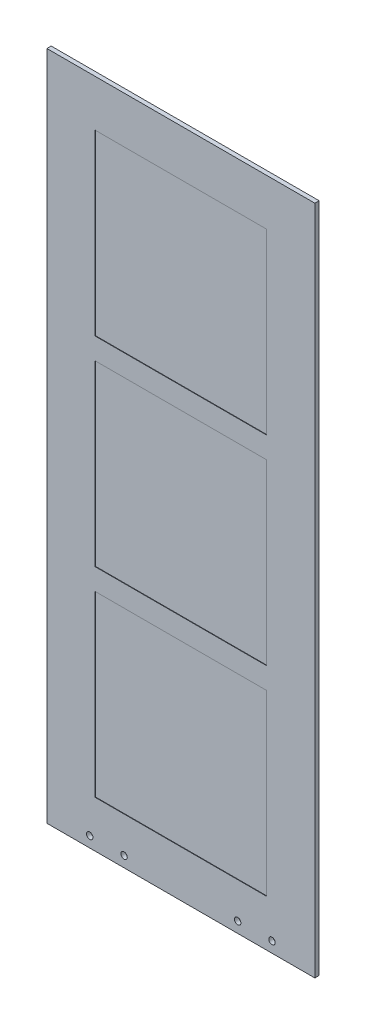
ISO-10303-21;
HEADER;
FILE_DESCRIPTION(('STEP AP214'),'2;1');
FILE_NAME('part.step','',(''),(''),'','','');
FILE_SCHEMA(('AUTOMOTIVE_DESIGN { 1 0 10303 214 1 1 1 1 }'));
ENDSEC;
DATA;
#1=APPLICATION_CONTEXT('core data for automotive mechanical design processes');
#2=APPLICATION_PROTOCOL_DEFINITION('international standard','automotive_design',2000,#1);
#3=PRODUCT_CONTEXT('',#1,'mechanical');
#4=PRODUCT('Part','Part','',(#3));
#5=PRODUCT_RELATED_PRODUCT_CATEGORY('part','',(#4));
#6=PRODUCT_DEFINITION_FORMATION('','',#4);
#7=PRODUCT_DEFINITION_CONTEXT('part definition',#1,'design');
#8=PRODUCT_DEFINITION('design','',#6,#7);
#9=PRODUCT_DEFINITION_SHAPE('','',#8);
#10=(LENGTH_UNIT() NAMED_UNIT(*) SI_UNIT(.MILLI.,.METRE.));
#11=(NAMED_UNIT(*) PLANE_ANGLE_UNIT() SI_UNIT($,.RADIAN.));
#12=(NAMED_UNIT(*) SI_UNIT($,.STERADIAN.) SOLID_ANGLE_UNIT());
#13=UNCERTAINTY_MEASURE_WITH_UNIT(LENGTH_MEASURE(1.E-05),#10,'distance_accuracy_value','');
#14=(GEOMETRIC_REPRESENTATION_CONTEXT(3) GLOBAL_UNCERTAINTY_ASSIGNED_CONTEXT((#13)) GLOBAL_UNIT_ASSIGNED_CONTEXT((#10,
#11,#12)) REPRESENTATION_CONTEXT('',''));
#15=CARTESIAN_POINT('',(0.,0.,0.));
#16=DIRECTION('',(0.,0.,1.));
#17=DIRECTION('',(1.,0.,0.));
#18=AXIS2_PLACEMENT_3D('',#15,#16,#17);
#19=CARTESIAN_POINT('',(0.,0.,1.771));
#20=DIRECTION('',(0.,0.,1.));
#21=DIRECTION('',(1.,0.,0.));
#22=AXIS2_PLACEMENT_3D('',#19,#20,#21);
#23=PLANE('',#22);
#24=DIRECTION('',(0.,1.,0.));
#25=VECTOR('',#24,1.);
#26=CARTESIAN_POINT('',(40.,51.586,1.771));
#27=LINE('',#26,#25);
#28=CARTESIAN_POINT('',(40.,134.758,1.771));
#29=VERTEX_POINT('',#28);
#30=CARTESIAN_POINT('',(40.,51.586,1.771));
#31=VERTEX_POINT('',#30);
#32=EDGE_CURVE('E134',#29,#31,#27,.F.);
#33=ORIENTED_EDGE('',*,*,#32,.F.);
#34=DIRECTION('',(1.,0.,0.));
#35=VECTOR('',#34,1.);
#36=CARTESIAN_POINT('',(-40.,134.758,1.771));
#37=LINE('',#36,#35);
#38=CARTESIAN_POINT('',(-40.,134.758,1.771));
#39=VERTEX_POINT('',#38);
#40=EDGE_CURVE('E275',#29,#39,#37,.F.);
#41=ORIENTED_EDGE('',*,*,#40,.T.);
#42=DIRECTION('',(0.,1.,0.));
#43=VECTOR('',#42,1.);
#44=CARTESIAN_POINT('',(-40.,134.758,1.771));
#45=LINE('',#44,#43);
#46=CARTESIAN_POINT('',(-40.,51.586,1.771));
#47=VERTEX_POINT('',#46);
#48=EDGE_CURVE('E148',#47,#39,#45,.T.);
#49=ORIENTED_EDGE('',*,*,#48,.F.);
#50=DIRECTION('',(1.,0.,0.));
#51=VECTOR('',#50,1.);
#52=CARTESIAN_POINT('',(40.,51.586,1.771));
#53=LINE('',#52,#51);
#54=EDGE_CURVE('E127',#47,#31,#53,.T.);
#55=ORIENTED_EDGE('',*,*,#54,.T.);
#56=EDGE_LOOP('',(#33,#41,#49,#55));
#57=FACE_BOUND('',#56,.T.);
#58=ADVANCED_FACE('F16',(#57),#23,.T.);
#59=CARTESIAN_POINT('',(0.,0.,1.771));
#60=DIRECTION('',(0.,0.,1.));
#61=DIRECTION('',(1.,0.,0.));
#62=AXIS2_PLACEMENT_3D('',#59,#60,#61);
#63=PLANE('',#62);
#64=DIRECTION('',(0.,1.,0.));
#65=VECTOR('',#64,1.);
#66=CARTESIAN_POINT('',(40.,51.586,1.771));
#67=LINE('',#66,#65);
#68=CARTESIAN_POINT('',(40.,41.586,1.771));
#69=VERTEX_POINT('',#68);
#70=CARTESIAN_POINT('',(40.,-41.586,1.771));
#71=VERTEX_POINT('',#70);
#72=EDGE_CURVE('E269',#69,#71,#67,.F.);
#73=ORIENTED_EDGE('',*,*,#72,.F.);
#74=DIRECTION('',(1.,0.,0.));
#75=VECTOR('',#74,1.);
#76=CARTESIAN_POINT('',(-40.,41.586,1.771));
#77=LINE('',#76,#75);
#78=CARTESIAN_POINT('',(-40.,41.586,1.771));
#79=VERTEX_POINT('',#78);
#80=EDGE_CURVE('E255',#69,#79,#77,.F.);
#81=ORIENTED_EDGE('',*,*,#80,.T.);
#82=DIRECTION('',(0.,1.,0.));
#83=VECTOR('',#82,1.);
#84=CARTESIAN_POINT('',(-40.,134.758,1.771));
#85=LINE('',#84,#83);
#86=CARTESIAN_POINT('',(-40.,-41.586,1.771));
#87=VERTEX_POINT('',#86);
#88=EDGE_CURVE('E258',#87,#79,#85,.T.);
#89=ORIENTED_EDGE('',*,*,#88,.F.);
#90=DIRECTION('',(1.,0.,0.));
#91=VECTOR('',#90,1.);
#92=CARTESIAN_POINT('',(40.,-41.586,1.771));
#93=LINE('',#92,#91);
#94=EDGE_CURVE('E266',#87,#71,#93,.T.);
#95=ORIENTED_EDGE('',*,*,#94,.T.);
#96=EDGE_LOOP('',(#73,#81,#89,#95));
#97=FACE_BOUND('',#96,.T.);
#98=ADVANCED_FACE('F378',(#97),#63,.T.);
#99=CARTESIAN_POINT('',(0.,0.,1.771));
#100=DIRECTION('',(0.,0.,1.));
#101=DIRECTION('',(1.,0.,0.));
#102=AXIS2_PLACEMENT_3D('',#99,#100,#101);
#103=PLANE('',#102);
#104=DIRECTION('',(0.,1.,0.));
#105=VECTOR('',#104,1.);
#106=CARTESIAN_POINT('',(40.,51.586,1.771));
#107=LINE('',#106,#105);
#108=CARTESIAN_POINT('',(40.,-51.586,1.771));
#109=VERTEX_POINT('',#108);
#110=CARTESIAN_POINT('',(40.,-134.758,1.771));
#111=VERTEX_POINT('',#110);
#112=EDGE_CURVE('E247',#109,#111,#107,.F.);
#113=ORIENTED_EDGE('',*,*,#112,.F.);
#114=DIRECTION('',(1.,0.,0.));
#115=VECTOR('',#114,1.);
#116=CARTESIAN_POINT('',(-40.,-51.586,1.771));
#117=LINE('',#116,#115);
#118=CARTESIAN_POINT('',(-40.,-51.586,1.771));
#119=VERTEX_POINT('',#118);
#120=EDGE_CURVE('E233',#109,#119,#117,.F.);
#121=ORIENTED_EDGE('',*,*,#120,.T.);
#122=DIRECTION('',(0.,1.,0.));
#123=VECTOR('',#122,1.);
#124=CARTESIAN_POINT('',(-40.,134.758,1.771));
#125=LINE('',#124,#123);
#126=CARTESIAN_POINT('',(-40.,-134.758,1.771));
#127=VERTEX_POINT('',#126);
#128=EDGE_CURVE('E236',#127,#119,#125,.T.);
#129=ORIENTED_EDGE('',*,*,#128,.F.);
#130=DIRECTION('',(1.,0.,0.));
#131=VECTOR('',#130,1.);
#132=CARTESIAN_POINT('',(40.,-134.758,1.771));
#133=LINE('',#132,#131);
#134=EDGE_CURVE('E244',#127,#111,#133,.T.);
#135=ORIENTED_EDGE('',*,*,#134,.T.);
#136=EDGE_LOOP('',(#113,#121,#129,#135));
#137=FACE_BOUND('',#136,.T.);
#138=ADVANCED_FACE('F382',(#137),#103,.T.);
#139=CARTESIAN_POINT('',(40.,51.586,1.996));
#140=DIRECTION('',(-1.,0.,0.));
#141=DIRECTION('',(0.,0.,1.));
#142=AXIS2_PLACEMENT_3D('',#139,#140,#141);
#143=PLANE('',#142);
#144=DIRECTION('',(0.,0.,1.));
#145=VECTOR('',#144,1.);
#146=CARTESIAN_POINT('',(40.,134.758,1.996));
#147=LINE('',#146,#145);
#148=CARTESIAN_POINT('',(40.,134.758,1.996));
#149=VERTEX_POINT('',#148);
#150=EDGE_CURVE('E139',#149,#29,#147,.F.);
#151=ORIENTED_EDGE('',*,*,#150,.T.);
#152=ORIENTED_EDGE('',*,*,#32,.T.);
#153=DIRECTION('',(0.,0.,-1.));
#154=VECTOR('',#153,1.);
#155=CARTESIAN_POINT('',(40.,51.586,1.996));
#156=LINE('',#155,#154);
#157=CARTESIAN_POINT('',(40.,51.586,1.996));
#158=VERTEX_POINT('',#157);
#159=EDGE_CURVE('E137',#31,#158,#156,.F.);
#160=ORIENTED_EDGE('',*,*,#159,.T.);
#161=DIRECTION('',(0.,1.,0.));
#162=VECTOR('',#161,1.);
#163=CARTESIAN_POINT('',(40.,0.,1.996));
#164=LINE('',#163,#162);
#165=EDGE_CURVE('E225',#149,#158,#164,.F.);
#166=ORIENTED_EDGE('',*,*,#165,.F.);
#167=EDGE_LOOP('',(#151,#152,#160,#166));
#168=FACE_BOUND('',#167,.T.);
#169=ADVANCED_FACE('F135',(#168),#143,.T.);
#170=CARTESIAN_POINT('',(40.,51.586,1.996));
#171=DIRECTION('',(0.,-1.,0.));
#172=DIRECTION('',(0.,0.,-1.));
#173=AXIS2_PLACEMENT_3D('',#170,#171,#172);
#174=PLANE('',#173);
#175=DIRECTION('',(1.,0.,0.));
#176=VECTOR('',#175,1.);
#177=CARTESIAN_POINT('',(0.,51.586,1.996));
#178=LINE('',#177,#176);
#179=CARTESIAN_POINT('',(-40.,51.586,1.996));
#180=VERTEX_POINT('',#179);
#181=EDGE_CURVE('E144',#158,#180,#178,.F.);
#182=ORIENTED_EDGE('',*,*,#181,.F.);
#183=ORIENTED_EDGE('',*,*,#159,.F.);
#184=ORIENTED_EDGE('',*,*,#54,.F.);
#185=DIRECTION('',(0.,0.,-1.));
#186=VECTOR('',#185,1.);
#187=CARTESIAN_POINT('',(-40.,51.586,1.996));
#188=LINE('',#187,#186);
#189=EDGE_CURVE('E145',#180,#47,#188,.T.);
#190=ORIENTED_EDGE('',*,*,#189,.F.);
#191=EDGE_LOOP('',(#182,#183,#184,#190));
#192=FACE_BOUND('',#191,.T.);
#193=ADVANCED_FACE('F143',(#192),#174,.F.);
#194=CARTESIAN_POINT('',(-40.,134.758,1.996));
#195=DIRECTION('',(1.,0.,0.));
#196=DIRECTION('',(0.,0.,-1.));
#197=AXIS2_PLACEMENT_3D('',#194,#195,#196);
#198=PLANE('',#197);
#199=ORIENTED_EDGE('',*,*,#189,.T.);
#200=ORIENTED_EDGE('',*,*,#48,.T.);
#201=DIRECTION('',(0.,0.,1.));
#202=VECTOR('',#201,1.);
#203=CARTESIAN_POINT('',(-40.,134.758,1.996));
#204=LINE('',#203,#202);
#205=CARTESIAN_POINT('',(-40.,134.758,1.996));
#206=VERTEX_POINT('',#205);
#207=EDGE_CURVE('E272',#39,#206,#204,.T.);
#208=ORIENTED_EDGE('',*,*,#207,.T.);
#209=DIRECTION('',(0.,1.,0.));
#210=VECTOR('',#209,1.);
#211=CARTESIAN_POINT('',(-40.,0.,1.996));
#212=LINE('',#211,#210);
#213=EDGE_CURVE('E222',#180,#206,#212,.T.);
#214=ORIENTED_EDGE('',*,*,#213,.F.);
#215=EDGE_LOOP('',(#199,#200,#208,#214));
#216=FACE_BOUND('',#215,.T.);
#217=ADVANCED_FACE('F279',(#216),#198,.T.);
#218=CARTESIAN_POINT('',(-40.,134.758,1.996));
#219=DIRECTION('',(0.,1.,0.));
#220=DIRECTION('',(0.,0.,1.));
#221=AXIS2_PLACEMENT_3D('',#218,#219,#220);
#222=PLANE('',#221);
#223=DIRECTION('',(1.,0.,0.));
#224=VECTOR('',#223,1.);
#225=CARTESIAN_POINT('',(0.,134.758,1.996));
#226=LINE('',#225,#224);
#227=EDGE_CURVE('E219',#206,#149,#226,.T.);
#228=ORIENTED_EDGE('',*,*,#227,.F.);
#229=ORIENTED_EDGE('',*,*,#207,.F.);
#230=ORIENTED_EDGE('',*,*,#40,.F.);
#231=ORIENTED_EDGE('',*,*,#150,.F.);
#232=EDGE_LOOP('',(#228,#229,#230,#231));
#233=FACE_BOUND('',#232,.T.);
#234=ADVANCED_FACE('F285',(#233),#222,.F.);
#235=CARTESIAN_POINT('',(40.,51.586,1.996));
#236=DIRECTION('',(-1.,0.,0.));
#237=DIRECTION('',(0.,0.,1.));
#238=AXIS2_PLACEMENT_3D('',#235,#236,#237);
#239=PLANE('',#238);
#240=DIRECTION('',(0.,0.,1.));
#241=VECTOR('',#240,1.);
#242=CARTESIAN_POINT('',(40.,41.586,1.996));
#243=LINE('',#242,#241);
#244=CARTESIAN_POINT('',(40.,41.586,1.996));
#245=VERTEX_POINT('',#244);
#246=EDGE_CURVE('E249',#245,#69,#243,.F.);
#247=ORIENTED_EDGE('',*,*,#246,.T.);
#248=ORIENTED_EDGE('',*,*,#72,.T.);
#249=DIRECTION('',(0.,0.,-1.));
#250=VECTOR('',#249,1.);
#251=CARTESIAN_POINT('',(40.,-41.586,1.996));
#252=LINE('',#251,#250);
#253=CARTESIAN_POINT('',(40.,-41.586,1.996));
#254=VERTEX_POINT('',#253);
#255=EDGE_CURVE('E263',#71,#254,#252,.F.);
#256=ORIENTED_EDGE('',*,*,#255,.T.);
#257=DIRECTION('',(0.,1.,0.));
#258=VECTOR('',#257,1.);
#259=CARTESIAN_POINT('',(40.,0.,1.996));
#260=LINE('',#259,#258);
#261=EDGE_CURVE('E217',#245,#254,#260,.F.);
#262=ORIENTED_EDGE('',*,*,#261,.F.);
#263=EDGE_LOOP('',(#247,#248,#256,#262));
#264=FACE_BOUND('',#263,.T.);
#265=ADVANCED_FACE('F287',(#264),#239,.T.);
#266=CARTESIAN_POINT('',(40.,-41.586,1.996));
#267=DIRECTION('',(0.,-1.,0.));
#268=DIRECTION('',(0.,0.,-1.));
#269=AXIS2_PLACEMENT_3D('',#266,#267,#268);
#270=PLANE('',#269);
#271=DIRECTION('',(1.,0.,0.));
#272=VECTOR('',#271,1.);
#273=CARTESIAN_POINT('',(0.,-41.586,1.996));
#274=LINE('',#273,#272);
#275=CARTESIAN_POINT('',(-40.,-41.586,1.996));
#276=VERTEX_POINT('',#275);
#277=EDGE_CURVE('E215',#254,#276,#274,.F.);
#278=ORIENTED_EDGE('',*,*,#277,.F.);
#279=ORIENTED_EDGE('',*,*,#255,.F.);
#280=ORIENTED_EDGE('',*,*,#94,.F.);
#281=DIRECTION('',(0.,0.,-1.));
#282=VECTOR('',#281,1.);
#283=CARTESIAN_POINT('',(-40.,-41.586,1.996));
#284=LINE('',#283,#282);
#285=EDGE_CURVE('E260',#276,#87,#284,.T.);
#286=ORIENTED_EDGE('',*,*,#285,.F.);
#287=EDGE_LOOP('',(#278,#279,#280,#286));
#288=FACE_BOUND('',#287,.T.);
#289=ADVANCED_FACE('F294',(#288),#270,.F.);
#290=CARTESIAN_POINT('',(-40.,134.758,1.996));
#291=DIRECTION('',(1.,0.,0.));
#292=DIRECTION('',(0.,0.,-1.));
#293=AXIS2_PLACEMENT_3D('',#290,#291,#292);
#294=PLANE('',#293);
#295=ORIENTED_EDGE('',*,*,#285,.T.);
#296=ORIENTED_EDGE('',*,*,#88,.T.);
#297=DIRECTION('',(0.,0.,1.));
#298=VECTOR('',#297,1.);
#299=CARTESIAN_POINT('',(-40.,41.586,1.996));
#300=LINE('',#299,#298);
#301=CARTESIAN_POINT('',(-40.,41.586,1.996));
#302=VERTEX_POINT('',#301);
#303=EDGE_CURVE('E252',#79,#302,#300,.T.);
#304=ORIENTED_EDGE('',*,*,#303,.T.);
#305=DIRECTION('',(0.,1.,0.));
#306=VECTOR('',#305,1.);
#307=CARTESIAN_POINT('',(-40.,0.,1.996));
#308=LINE('',#307,#306);
#309=EDGE_CURVE('E213',#276,#302,#308,.T.);
#310=ORIENTED_EDGE('',*,*,#309,.F.);
#311=EDGE_LOOP('',(#295,#296,#304,#310));
#312=FACE_BOUND('',#311,.T.);
#313=ADVANCED_FACE('F359',(#312),#294,.T.);
#314=CARTESIAN_POINT('',(-40.,41.586,1.996));
#315=DIRECTION('',(0.,1.,0.));
#316=DIRECTION('',(0.,0.,1.));
#317=AXIS2_PLACEMENT_3D('',#314,#315,#316);
#318=PLANE('',#317);
#319=DIRECTION('',(1.,0.,0.));
#320=VECTOR('',#319,1.);
#321=CARTESIAN_POINT('',(0.,41.586,1.996));
#322=LINE('',#321,#320);
#323=EDGE_CURVE('E210',#302,#245,#322,.T.);
#324=ORIENTED_EDGE('',*,*,#323,.F.);
#325=ORIENTED_EDGE('',*,*,#303,.F.);
#326=ORIENTED_EDGE('',*,*,#80,.F.);
#327=ORIENTED_EDGE('',*,*,#246,.F.);
#328=EDGE_LOOP('',(#324,#325,#326,#327));
#329=FACE_BOUND('',#328,.T.);
#330=ADVANCED_FACE('F355',(#329),#318,.F.);
#331=CARTESIAN_POINT('',(40.,51.586,1.996));
#332=DIRECTION('',(-1.,0.,0.));
#333=DIRECTION('',(0.,0.,1.));
#334=AXIS2_PLACEMENT_3D('',#331,#332,#333);
#335=PLANE('',#334);
#336=DIRECTION('',(0.,0.,1.));
#337=VECTOR('',#336,1.);
#338=CARTESIAN_POINT('',(40.,-51.586,1.996));
#339=LINE('',#338,#337);
#340=CARTESIAN_POINT('',(40.,-51.586,1.996));
#341=VERTEX_POINT('',#340);
#342=EDGE_CURVE('E227',#341,#109,#339,.F.);
#343=ORIENTED_EDGE('',*,*,#342,.T.);
#344=ORIENTED_EDGE('',*,*,#112,.T.);
#345=DIRECTION('',(0.,0.,-1.));
#346=VECTOR('',#345,1.);
#347=CARTESIAN_POINT('',(40.,-134.758,1.996));
#348=LINE('',#347,#346);
#349=CARTESIAN_POINT('',(40.,-134.758,1.996));
#350=VERTEX_POINT('',#349);
#351=EDGE_CURVE('E241',#111,#350,#348,.F.);
#352=ORIENTED_EDGE('',*,*,#351,.T.);
#353=DIRECTION('',(0.,1.,0.));
#354=VECTOR('',#353,1.);
#355=CARTESIAN_POINT('',(40.,0.,1.996));
#356=LINE('',#355,#354);
#357=EDGE_CURVE('E208',#341,#350,#356,.F.);
#358=ORIENTED_EDGE('',*,*,#357,.F.);
#359=EDGE_LOOP('',(#343,#344,#352,#358));
#360=FACE_BOUND('',#359,.T.);
#361=ADVANCED_FACE('F351',(#360),#335,.T.);
#362=CARTESIAN_POINT('',(40.,-134.758,1.996));
#363=DIRECTION('',(0.,-1.,0.));
#364=DIRECTION('',(0.,0.,-1.));
#365=AXIS2_PLACEMENT_3D('',#362,#363,#364);
#366=PLANE('',#365);
#367=DIRECTION('',(1.,0.,0.));
#368=VECTOR('',#367,1.);
#369=CARTESIAN_POINT('',(0.,-134.758,1.996));
#370=LINE('',#369,#368);
#371=CARTESIAN_POINT('',(-40.,-134.758,1.996));
#372=VERTEX_POINT('',#371);
#373=EDGE_CURVE('E206',#350,#372,#370,.F.);
#374=ORIENTED_EDGE('',*,*,#373,.F.);
#375=ORIENTED_EDGE('',*,*,#351,.F.);
#376=ORIENTED_EDGE('',*,*,#134,.F.);
#377=DIRECTION('',(0.,0.,-1.));
#378=VECTOR('',#377,1.);
#379=CARTESIAN_POINT('',(-40.,-134.758,1.996));
#380=LINE('',#379,#378);
#381=EDGE_CURVE('E238',#372,#127,#380,.T.);
#382=ORIENTED_EDGE('',*,*,#381,.F.);
#383=EDGE_LOOP('',(#374,#375,#376,#382));
#384=FACE_BOUND('',#383,.T.);
#385=ADVANCED_FACE('F347',(#384),#366,.F.);
#386=CARTESIAN_POINT('',(-40.,134.758,1.996));
#387=DIRECTION('',(1.,0.,0.));
#388=DIRECTION('',(0.,0.,-1.));
#389=AXIS2_PLACEMENT_3D('',#386,#387,#388);
#390=PLANE('',#389);
#391=ORIENTED_EDGE('',*,*,#381,.T.);
#392=ORIENTED_EDGE('',*,*,#128,.T.);
#393=DIRECTION('',(0.,0.,1.));
#394=VECTOR('',#393,1.);
#395=CARTESIAN_POINT('',(-40.,-51.586,1.996));
#396=LINE('',#395,#394);
#397=CARTESIAN_POINT('',(-40.,-51.586,1.996));
#398=VERTEX_POINT('',#397);
#399=EDGE_CURVE('E230',#119,#398,#396,.T.);
#400=ORIENTED_EDGE('',*,*,#399,.T.);
#401=DIRECTION('',(0.,1.,0.));
#402=VECTOR('',#401,1.);
#403=CARTESIAN_POINT('',(-40.,0.,1.996));
#404=LINE('',#403,#402);
#405=EDGE_CURVE('E204',#372,#398,#404,.T.);
#406=ORIENTED_EDGE('',*,*,#405,.F.);
#407=EDGE_LOOP('',(#391,#392,#400,#406));
#408=FACE_BOUND('',#407,.T.);
#409=ADVANCED_FACE('F343',(#408),#390,.T.);
#410=CARTESIAN_POINT('',(-40.,-51.586,1.996));
#411=DIRECTION('',(0.,1.,0.));
#412=DIRECTION('',(0.,0.,1.));
#413=AXIS2_PLACEMENT_3D('',#410,#411,#412);
#414=PLANE('',#413);
#415=DIRECTION('',(1.,0.,0.));
#416=VECTOR('',#415,1.);
#417=CARTESIAN_POINT('',(0.,-51.586,1.996));
#418=LINE('',#417,#416);
#419=EDGE_CURVE('E201',#398,#341,#418,.T.);
#420=ORIENTED_EDGE('',*,*,#419,.F.);
#421=ORIENTED_EDGE('',*,*,#399,.F.);
#422=ORIENTED_EDGE('',*,*,#120,.F.);
#423=ORIENTED_EDGE('',*,*,#342,.F.);
#424=EDGE_LOOP('',(#420,#421,#422,#423));
#425=FACE_BOUND('',#424,.T.);
#426=ADVANCED_FACE('F339',(#425),#414,.F.);
#427=CARTESIAN_POINT('',(0.,0.,1.996));
#428=DIRECTION('',(0.,0.,1.));
#429=DIRECTION('',(1.,0.,0.));
#430=AXIS2_PLACEMENT_3D('',#427,#428,#429);
#431=PLANE('',#430);
#432=ORIENTED_EDGE('',*,*,#405,.T.);
#433=ORIENTED_EDGE('',*,*,#419,.T.);
#434=ORIENTED_EDGE('',*,*,#357,.T.);
#435=ORIENTED_EDGE('',*,*,#373,.T.);
#436=EDGE_LOOP('',(#432,#433,#434,#435));
#437=FACE_BOUND('',#436,.T.);
#438=ORIENTED_EDGE('',*,*,#309,.T.);
#439=ORIENTED_EDGE('',*,*,#323,.T.);
#440=ORIENTED_EDGE('',*,*,#261,.T.);
#441=ORIENTED_EDGE('',*,*,#277,.T.);
#442=EDGE_LOOP('',(#438,#439,#440,#441));
#443=FACE_BOUND('',#442,.T.);
#444=CARTESIAN_POINT('',(42.5,-151.5,1.996));
#445=DIRECTION('',(0.,0.,-1.));
#446=DIRECTION('',(-1.,0.,0.));
#447=AXIS2_PLACEMENT_3D('',#444,#445,#446);
#448=CIRCLE('',#447,1.5);
#449=CARTESIAN_POINT('',(41.,-151.5,1.996));
#450=VERTEX_POINT('',#449);
#451=EDGE_CURVE('E161',#450,#450,#448,.T.);
#452=ORIENTED_EDGE('',*,*,#451,.T.);
#453=EDGE_LOOP('',(#452));
#454=FACE_BOUND('',#453,.T.);
#455=CARTESIAN_POINT('',(-42.5,-151.5,1.996));
#456=DIRECTION('',(0.,0.,-1.));
#457=DIRECTION('',(-1.,0.,0.));
#458=AXIS2_PLACEMENT_3D('',#455,#456,#457);
#459=CIRCLE('',#458,1.5);
#460=CARTESIAN_POINT('',(-44.,-151.5,1.996));
#461=VERTEX_POINT('',#460);
#462=EDGE_CURVE('E165',#461,#461,#459,.T.);
#463=ORIENTED_EDGE('',*,*,#462,.T.);
#464=EDGE_LOOP('',(#463));
#465=FACE_BOUND('',#464,.T.);
#466=ORIENTED_EDGE('',*,*,#213,.T.);
#467=ORIENTED_EDGE('',*,*,#227,.T.);
#468=ORIENTED_EDGE('',*,*,#165,.T.);
#469=ORIENTED_EDGE('',*,*,#181,.T.);
#470=EDGE_LOOP('',(#466,#467,#468,#469));
#471=FACE_BOUND('',#470,.T.);
#472=CARTESIAN_POINT('',(26.5,-151.5,1.996));
#473=DIRECTION('',(0.,0.,-1.));
#474=DIRECTION('',(-1.,0.,0.));
#475=AXIS2_PLACEMENT_3D('',#472,#473,#474);
#476=CIRCLE('',#475,1.5);
#477=CARTESIAN_POINT('',(25.,-151.5,1.996));
#478=VERTEX_POINT('',#477);
#479=EDGE_CURVE('E167',#478,#478,#476,.T.);
#480=ORIENTED_EDGE('',*,*,#479,.T.);
#481=EDGE_LOOP('',(#480));
#482=FACE_BOUND('',#481,.T.);
#483=CARTESIAN_POINT('',(-26.5,-151.5,1.996));
#484=DIRECTION('',(0.,0.,-1.));
#485=DIRECTION('',(-1.,0.,0.));
#486=AXIS2_PLACEMENT_3D('',#483,#484,#485);
#487=CIRCLE('',#486,1.5);
#488=CARTESIAN_POINT('',(-28.,-151.5,1.996));
#489=VERTEX_POINT('',#488);
#490=EDGE_CURVE('E19',#489,#489,#487,.T.);
#491=ORIENTED_EDGE('',*,*,#490,.T.);
#492=EDGE_LOOP('',(#491));
#493=FACE_BOUND('',#492,.T.);
#494=DIRECTION('',(1.,0.,0.));
#495=VECTOR('',#494,1.);
#496=CARTESIAN_POINT('',(62.5,-156.5,1.996));
#497=LINE('',#496,#495);
#498=CARTESIAN_POINT('',(-62.5,-156.5,1.996));
#499=VERTEX_POINT('',#498);
#500=CARTESIAN_POINT('',(62.5,-156.5,1.996));
#501=VERTEX_POINT('',#500);
#502=EDGE_CURVE('E189',#499,#501,#497,.T.);
#503=ORIENTED_EDGE('',*,*,#502,.T.);
#504=DIRECTION('',(0.,1.,0.));
#505=VECTOR('',#504,1.);
#506=CARTESIAN_POINT('',(62.5,156.5,1.996));
#507=LINE('',#506,#505);
#508=CARTESIAN_POINT('',(62.5,156.5,1.996));
#509=VERTEX_POINT('',#508);
#510=EDGE_CURVE('E179',#501,#509,#507,.T.);
#511=ORIENTED_EDGE('',*,*,#510,.T.);
#512=DIRECTION('',(1.,0.,0.));
#513=VECTOR('',#512,1.);
#514=CARTESIAN_POINT('',(-62.5,156.5,1.996));
#515=LINE('',#514,#513);
#516=CARTESIAN_POINT('',(-62.5,156.5,1.996));
#517=VERTEX_POINT('',#516);
#518=EDGE_CURVE('E198',#509,#517,#515,.F.);
#519=ORIENTED_EDGE('',*,*,#518,.T.);
#520=DIRECTION('',(0.,1.,0.));
#521=VECTOR('',#520,1.);
#522=CARTESIAN_POINT('',(-62.5,-156.5,1.996));
#523=LINE('',#522,#521);
#524=EDGE_CURVE('E195',#517,#499,#523,.F.);
#525=ORIENTED_EDGE('',*,*,#524,.T.);
#526=EDGE_LOOP('',(#503,#511,#519,#525));
#527=FACE_BOUND('',#526,.T.);
#528=ADVANCED_FACE('F283',(#437,#443,#454,#465,#471,#482,#493,#527),#431,.T.);
#529=CARTESIAN_POINT('',(-62.5,156.5,0.));
#530=DIRECTION('',(0.,-1.,0.));
#531=DIRECTION('',(0.,0.,-1.));
#532=AXIS2_PLACEMENT_3D('',#529,#530,#531);
#533=PLANE('',#532);
#534=DIRECTION('',(1.,0.,0.));
#535=VECTOR('',#534,1.);
#536=CARTESIAN_POINT('',(0.,156.5,0.));
#537=LINE('',#536,#535);
#538=CARTESIAN_POINT('',(62.5,156.5,0.));
#539=VERTEX_POINT('',#538);
#540=CARTESIAN_POINT('',(-62.5,156.5,0.));
#541=VERTEX_POINT('',#540);
#542=EDGE_CURVE('E164',#539,#541,#537,.F.);
#543=ORIENTED_EDGE('',*,*,#542,.T.);
#544=DIRECTION('',(0.,0.,-1.));
#545=VECTOR('',#544,1.);
#546=CARTESIAN_POINT('',(-62.5,156.5,0.));
#547=LINE('',#546,#545);
#548=EDGE_CURVE('E192',#541,#517,#547,.F.);
#549=ORIENTED_EDGE('',*,*,#548,.T.);
#550=ORIENTED_EDGE('',*,*,#518,.F.);
#551=DIRECTION('',(0.,0.,1.));
#552=VECTOR('',#551,1.);
#553=CARTESIAN_POINT('',(62.5,156.5,0.));
#554=LINE('',#553,#552);
#555=EDGE_CURVE('E174',#509,#539,#554,.F.);
#556=ORIENTED_EDGE('',*,*,#555,.T.);
#557=EDGE_LOOP('',(#543,#549,#550,#556));
#558=FACE_BOUND('',#557,.T.);
#559=ADVANCED_FACE('F332',(#558),#533,.F.);
#560=CARTESIAN_POINT('',(-62.5,-156.5,0.));
#561=DIRECTION('',(1.,0.,0.));
#562=DIRECTION('',(0.,0.,-1.));
#563=AXIS2_PLACEMENT_3D('',#560,#561,#562);
#564=PLANE('',#563);
#565=DIRECTION('',(0.,1.,0.));
#566=VECTOR('',#565,1.);
#567=CARTESIAN_POINT('',(-62.5,0.,0.));
#568=LINE('',#567,#566);
#569=CARTESIAN_POINT('',(-62.5,-156.5,0.));
#570=VERTEX_POINT('',#569);
#571=EDGE_CURVE('E565',#541,#570,#568,.F.);
#572=ORIENTED_EDGE('',*,*,#571,.T.);
#573=DIRECTION('',(0.,0.,1.));
#574=VECTOR('',#573,1.);
#575=CARTESIAN_POINT('',(-62.5,-156.5,0.));
#576=LINE('',#575,#574);
#577=EDGE_CURVE('E186',#570,#499,#576,.T.);
#578=ORIENTED_EDGE('',*,*,#577,.T.);
#579=ORIENTED_EDGE('',*,*,#524,.F.);
#580=ORIENTED_EDGE('',*,*,#548,.F.);
#581=EDGE_LOOP('',(#572,#578,#579,#580));
#582=FACE_BOUND('',#581,.T.);
#583=ADVANCED_FACE('F329',(#582),#564,.F.);
#584=CARTESIAN_POINT('',(62.5,-156.5,0.));
#585=DIRECTION('',(0.,1.,0.));
#586=DIRECTION('',(0.,0.,1.));
#587=AXIS2_PLACEMENT_3D('',#584,#585,#586);
#588=PLANE('',#587);
#589=DIRECTION('',(1.,0.,0.));
#590=VECTOR('',#589,1.);
#591=CARTESIAN_POINT('',(0.,-156.5,0.));
#592=LINE('',#591,#590);
#593=CARTESIAN_POINT('',(62.5,-156.5,0.));
#594=VERTEX_POINT('',#593);
#595=EDGE_CURVE('E567',#570,#594,#592,.T.);
#596=ORIENTED_EDGE('',*,*,#595,.T.);
#597=DIRECTION('',(0.,0.,1.));
#598=VECTOR('',#597,1.);
#599=CARTESIAN_POINT('',(62.5,-156.5,0.));
#600=LINE('',#599,#598);
#601=EDGE_CURVE('E34',#594,#501,#600,.T.);
#602=ORIENTED_EDGE('',*,*,#601,.T.);
#603=ORIENTED_EDGE('',*,*,#502,.F.);
#604=ORIENTED_EDGE('',*,*,#577,.F.);
#605=EDGE_LOOP('',(#596,#602,#603,#604));
#606=FACE_BOUND('',#605,.T.);
#607=ADVANCED_FACE('F326',(#606),#588,.F.);
#608=CARTESIAN_POINT('',(62.5,156.5,0.));
#609=DIRECTION('',(-1.,0.,0.));
#610=DIRECTION('',(0.,0.,1.));
#611=AXIS2_PLACEMENT_3D('',#608,#609,#610);
#612=PLANE('',#611);
#613=DIRECTION('',(0.,1.,0.));
#614=VECTOR('',#613,1.);
#615=CARTESIAN_POINT('',(62.5,0.,0.));
#616=LINE('',#615,#614);
#617=EDGE_CURVE('E160',#594,#539,#616,.T.);
#618=ORIENTED_EDGE('',*,*,#617,.T.);
#619=ORIENTED_EDGE('',*,*,#555,.F.);
#620=ORIENTED_EDGE('',*,*,#510,.F.);
#621=ORIENTED_EDGE('',*,*,#601,.F.);
#622=EDGE_LOOP('',(#618,#619,#620,#621));
#623=FACE_BOUND('',#622,.T.);
#624=ADVANCED_FACE('F322',(#623),#612,.F.);
#625=CARTESIAN_POINT('',(-26.5,-151.5,1.896));
#626=DIRECTION('',(0.,0.,-1.));
#627=DIRECTION('',(-1.,0.,0.));
#628=AXIS2_PLACEMENT_3D('',#625,#626,#627);
#629=CYLINDRICAL_SURFACE('',#628,1.5);
#630=CARTESIAN_POINT('',(-26.5,-151.5,0.));
#631=DIRECTION('',(0.,0.,-1.));
#632=DIRECTION('',(-1.,0.,0.));
#633=AXIS2_PLACEMENT_3D('',#630,#631,#632);
#634=CIRCLE('',#633,1.5);
#635=CARTESIAN_POINT('',(-28.,-151.5,0.));
#636=VERTEX_POINT('',#635);
#637=EDGE_CURVE('E157',#636,#636,#634,.T.);
#638=ORIENTED_EDGE('',*,*,#637,.T.);
#639=EDGE_LOOP('',(#638));
#640=FACE_BOUND('',#639,.T.);
#641=ORIENTED_EDGE('',*,*,#490,.F.);
#642=EDGE_LOOP('',(#641));
#643=FACE_BOUND('',#642,.T.);
#644=ADVANCED_FACE('F318',(#640,#643),#629,.F.);
#645=CARTESIAN_POINT('',(26.5,-151.5,1.896));
#646=DIRECTION('',(0.,0.,-1.));
#647=DIRECTION('',(-1.,0.,0.));
#648=AXIS2_PLACEMENT_3D('',#645,#646,#647);
#649=CYLINDRICAL_SURFACE('',#648,1.5);
#650=CARTESIAN_POINT('',(26.5,-151.5,0.));
#651=DIRECTION('',(0.,0.,-1.));
#652=DIRECTION('',(-1.,0.,0.));
#653=AXIS2_PLACEMENT_3D('',#650,#651,#652);
#654=CIRCLE('',#653,1.5);
#655=CARTESIAN_POINT('',(25.,-151.5,0.));
#656=VERTEX_POINT('',#655);
#657=EDGE_CURVE('E154',#656,#656,#654,.T.);
#658=ORIENTED_EDGE('',*,*,#657,.T.);
#659=EDGE_LOOP('',(#658));
#660=FACE_BOUND('',#659,.T.);
#661=ORIENTED_EDGE('',*,*,#479,.F.);
#662=EDGE_LOOP('',(#661));
#663=FACE_BOUND('',#662,.T.);
#664=ADVANCED_FACE('F314',(#660,#663),#649,.F.);
#665=CARTESIAN_POINT('',(-42.5,-151.5,1.896));
#666=DIRECTION('',(0.,0.,-1.));
#667=DIRECTION('',(-1.,0.,0.));
#668=AXIS2_PLACEMENT_3D('',#665,#666,#667);
#669=CYLINDRICAL_SURFACE('',#668,1.5);
#670=CARTESIAN_POINT('',(-42.5,-151.5,0.));
#671=DIRECTION('',(0.,0.,-1.));
#672=DIRECTION('',(-1.,0.,0.));
#673=AXIS2_PLACEMENT_3D('',#670,#671,#672);
#674=CIRCLE('',#673,1.5);
#675=CARTESIAN_POINT('',(-44.,-151.5,0.));
#676=VERTEX_POINT('',#675);
#677=EDGE_CURVE('E25',#676,#676,#674,.T.);
#678=ORIENTED_EDGE('',*,*,#677,.T.);
#679=EDGE_LOOP('',(#678));
#680=FACE_BOUND('',#679,.T.);
#681=ORIENTED_EDGE('',*,*,#462,.F.);
#682=EDGE_LOOP('',(#681));
#683=FACE_BOUND('',#682,.T.);
#684=ADVANCED_FACE('F306',(#680,#683),#669,.F.);
#685=CARTESIAN_POINT('',(42.5,-151.5,1.896));
#686=DIRECTION('',(0.,0.,-1.));
#687=DIRECTION('',(-1.,0.,0.));
#688=AXIS2_PLACEMENT_3D('',#685,#686,#687);
#689=CYLINDRICAL_SURFACE('',#688,1.5);
#690=CARTESIAN_POINT('',(42.5,-151.5,0.));
#691=DIRECTION('',(0.,0.,-1.));
#692=DIRECTION('',(-1.,0.,0.));
#693=AXIS2_PLACEMENT_3D('',#690,#691,#692);
#694=CIRCLE('',#693,1.5);
#695=CARTESIAN_POINT('',(41.,-151.5,0.));
#696=VERTEX_POINT('',#695);
#697=EDGE_CURVE('E11',#696,#696,#694,.T.);
#698=ORIENTED_EDGE('',*,*,#697,.T.);
#699=EDGE_LOOP('',(#698));
#700=FACE_BOUND('',#699,.T.);
#701=ORIENTED_EDGE('',*,*,#451,.F.);
#702=EDGE_LOOP('',(#701));
#703=FACE_BOUND('',#702,.T.);
#704=ADVANCED_FACE('F300',(#700,#703),#689,.F.);
#705=CARTESIAN_POINT('',(0.,0.,0.));
#706=DIRECTION('',(0.,0.,1.));
#707=DIRECTION('',(1.,0.,0.));
#708=AXIS2_PLACEMENT_3D('',#705,#706,#707);
#709=PLANE('',#708);
#710=ORIENTED_EDGE('',*,*,#697,.F.);
#711=EDGE_LOOP('',(#710));
#712=FACE_BOUND('',#711,.T.);
#713=ORIENTED_EDGE('',*,*,#677,.F.);
#714=EDGE_LOOP('',(#713));
#715=FACE_BOUND('',#714,.T.);
#716=ORIENTED_EDGE('',*,*,#657,.F.);
#717=EDGE_LOOP('',(#716));
#718=FACE_BOUND('',#717,.T.);
#719=ORIENTED_EDGE('',*,*,#637,.F.);
#720=EDGE_LOOP('',(#719));
#721=FACE_BOUND('',#720,.T.);
#722=ORIENTED_EDGE('',*,*,#595,.F.);
#723=ORIENTED_EDGE('',*,*,#571,.F.);
#724=ORIENTED_EDGE('',*,*,#542,.F.);
#725=ORIENTED_EDGE('',*,*,#617,.F.);
#726=EDGE_LOOP('',(#722,#723,#724,#725));
#727=FACE_BOUND('',#726,.T.);
#728=ADVANCED_FACE('F298',(#712,#715,#718,#721,#727),#709,.F.);
#729=CLOSED_SHELL('',(#58,#98,#138,#169,#193,#217,#234,#265,#289,#313,#330,#361,#385,#409,#426,
#528,#559,#583,#607,#624,#644,#664,#684,#704,#728));
#730=MANIFOLD_SOLID_BREP('B1',#729);
#731=ADVANCED_BREP_SHAPE_REPRESENTATION('',(#18,#730),#14);
#732=SHAPE_DEFINITION_REPRESENTATION(#9,#731);
ENDSEC;
END-ISO-10303-21;
